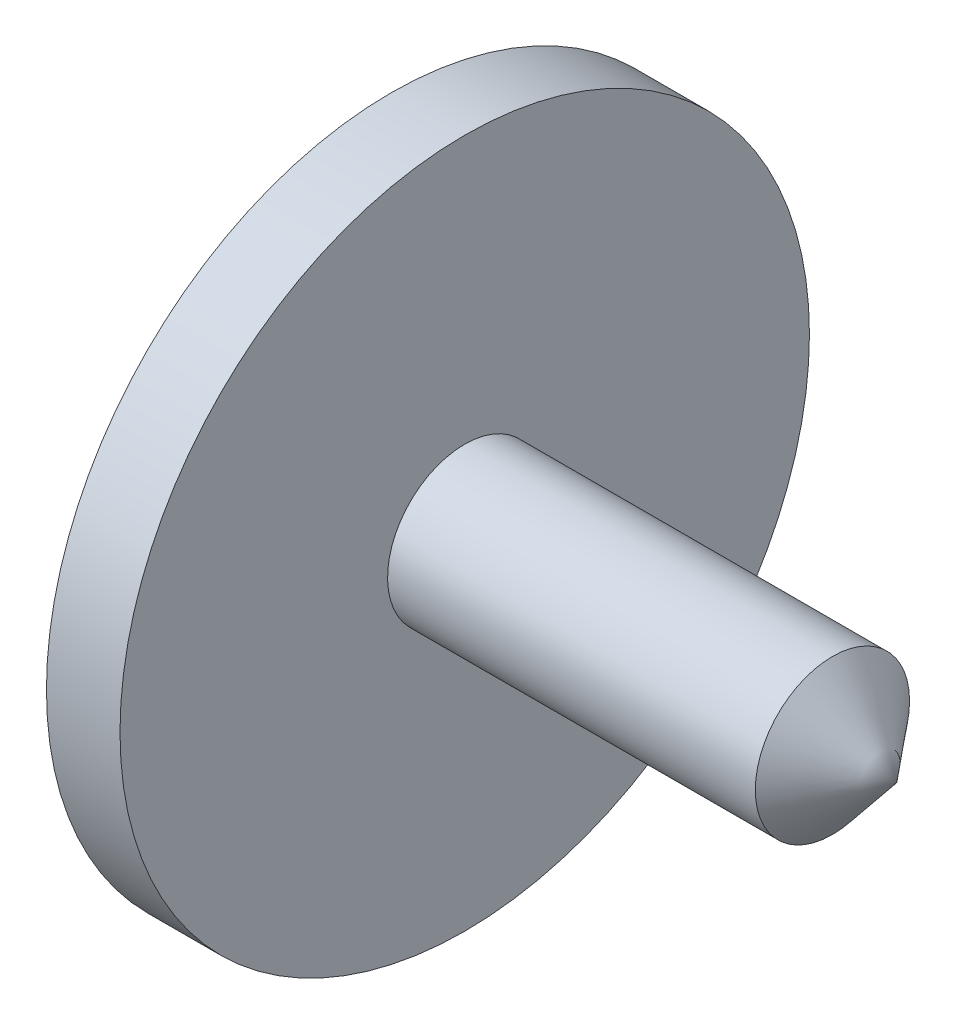
ISO-10303-21;
HEADER;
FILE_DESCRIPTION(('STEP AP214'),'2;1');
FILE_NAME('part.step','',(''),(''),'','','');
FILE_SCHEMA(('AUTOMOTIVE_DESIGN { 1 0 10303 214 1 1 1 1 }'));
ENDSEC;
DATA;
#1=APPLICATION_CONTEXT('core data for automotive mechanical design processes');
#2=APPLICATION_PROTOCOL_DEFINITION('international standard','automotive_design',2000,#1);
#3=PRODUCT_CONTEXT('',#1,'mechanical');
#4=PRODUCT('Part','Part','',(#3));
#5=PRODUCT_RELATED_PRODUCT_CATEGORY('part','',(#4));
#6=PRODUCT_DEFINITION_FORMATION('','',#4);
#7=PRODUCT_DEFINITION_CONTEXT('part definition',#1,'design');
#8=PRODUCT_DEFINITION('design','',#6,#7);
#9=PRODUCT_DEFINITION_SHAPE('','',#8);
#10=(LENGTH_UNIT() NAMED_UNIT(*) SI_UNIT(.MILLI.,.METRE.));
#11=(NAMED_UNIT(*) PLANE_ANGLE_UNIT() SI_UNIT($,.RADIAN.));
#12=(NAMED_UNIT(*) SI_UNIT($,.STERADIAN.) SOLID_ANGLE_UNIT());
#13=UNCERTAINTY_MEASURE_WITH_UNIT(LENGTH_MEASURE(1.E-05),#10,'distance_accuracy_value','');
#14=(GEOMETRIC_REPRESENTATION_CONTEXT(3) GLOBAL_UNCERTAINTY_ASSIGNED_CONTEXT((#13)) GLOBAL_UNIT_ASSIGNED_CONTEXT((#10,
#11,#12)) REPRESENTATION_CONTEXT('',''));
#15=CARTESIAN_POINT('',(0.,0.,0.));
#16=DIRECTION('',(0.,0.,1.));
#17=DIRECTION('',(1.,0.,0.));
#18=AXIS2_PLACEMENT_3D('',#15,#16,#17);
#19=CARTESIAN_POINT('',(0.,0.,0.));
#20=DIRECTION('',(-1.,0.,0.));
#21=DIRECTION('',(0.,-1.,0.));
#22=AXIS2_PLACEMENT_3D('',#19,#20,#21);
#23=PLANE('',#22);
#24=CARTESIAN_POINT('',(0.,0.,0.));
#25=DIRECTION('',(1.,0.,0.));
#26=DIRECTION('',(0.,1.,0.));
#27=AXIS2_PLACEMENT_3D('',#24,#25,#26);
#28=CIRCLE('',#27,37.5);
#29=CARTESIAN_POINT('',(0.,37.5,0.));
#30=VERTEX_POINT('',#29);
#31=EDGE_CURVE('E11',#30,#30,#28,.T.);
#32=ORIENTED_EDGE('',*,*,#31,.F.);
#33=EDGE_LOOP('',(#32));
#34=FACE_BOUND('',#33,.T.);
#35=ADVANCED_FACE('F34',(#34),#23,.T.);
#36=CARTESIAN_POINT('',(55.,0.,0.));
#37=DIRECTION('',(1.,0.,0.));
#38=DIRECTION('',(0.,1.,0.));
#39=AXIS2_PLACEMENT_3D('',#36,#37,#38);
#40=CYLINDRICAL_SURFACE('',#39,37.5);
#41=ORIENTED_EDGE('',*,*,#31,.T.);
#42=EDGE_LOOP('',(#41));
#43=FACE_BOUND('',#42,.T.);
#44=CARTESIAN_POINT('',(8.,0.,0.));
#45=DIRECTION('',(1.,0.,0.));
#46=DIRECTION('',(0.,1.,0.));
#47=AXIS2_PLACEMENT_3D('',#44,#45,#46);
#48=CIRCLE('',#47,37.5);
#49=CARTESIAN_POINT('',(8.,37.5,0.));
#50=VERTEX_POINT('',#49);
#51=EDGE_CURVE('E40',#50,#50,#48,.T.);
#52=ORIENTED_EDGE('',*,*,#51,.F.);
#53=EDGE_LOOP('',(#52));
#54=FACE_BOUND('',#53,.T.);
#55=ADVANCED_FACE('F56',(#43,#54),#40,.T.);
#56=CARTESIAN_POINT('',(8.,37.5,0.));
#57=DIRECTION('',(1.,0.,0.));
#58=DIRECTION('',(0.,1.,0.));
#59=AXIS2_PLACEMENT_3D('',#56,#57,#58);
#60=PLANE('',#59);
#61=ORIENTED_EDGE('',*,*,#51,.T.);
#62=EDGE_LOOP('',(#61));
#63=FACE_BOUND('',#62,.T.);
#64=CARTESIAN_POINT('',(8.,0.,0.));
#65=DIRECTION('',(1.,0.,0.));
#66=DIRECTION('',(0.,1.,0.));
#67=AXIS2_PLACEMENT_3D('',#64,#65,#66);
#68=CIRCLE('',#67,8.39041095890421);
#69=CARTESIAN_POINT('',(8.,8.39041095890421,0.));
#70=VERTEX_POINT('',#69);
#71=EDGE_CURVE('E67',#70,#70,#68,.T.);
#72=ORIENTED_EDGE('',*,*,#71,.F.);
#73=EDGE_LOOP('',(#72));
#74=FACE_BOUND('',#73,.T.);
#75=ADVANCED_FACE('F51',(#63,#74),#60,.T.);
#76=CARTESIAN_POINT('',(55.,0.,0.));
#77=DIRECTION('',(1.,0.,0.));
#78=DIRECTION('',(0.,1.,0.));
#79=AXIS2_PLACEMENT_3D('',#76,#77,#78);
#80=CYLINDRICAL_SURFACE('',#79,8.39041095890421);
#81=ORIENTED_EDGE('',*,*,#71,.T.);
#82=EDGE_LOOP('',(#81));
#83=FACE_BOUND('',#82,.T.);
#84=CARTESIAN_POINT('',(48.,0.,0.));
#85=DIRECTION('',(1.,0.,0.));
#86=DIRECTION('',(0.,1.,0.));
#87=AXIS2_PLACEMENT_3D('',#84,#85,#86);
#88=CIRCLE('',#87,8.39041095890422);
#89=CARTESIAN_POINT('',(48.,8.39041095890422,0.));
#90=VERTEX_POINT('',#89);
#91=EDGE_CURVE('E69',#90,#90,#88,.T.);
#92=ORIENTED_EDGE('',*,*,#91,.F.);
#93=EDGE_LOOP('',(#92));
#94=FACE_BOUND('',#93,.T.);
#95=ADVANCED_FACE('F45',(#83,#94),#80,.T.);
#96=CARTESIAN_POINT('',(55.,0.,0.));
#97=DIRECTION('',(-1.,0.,0.));
#98=DIRECTION('',(0.,-1.,0.));
#99=AXIS2_PLACEMENT_3D('',#96,#97,#98);
#100=CONICAL_SURFACE('',#99,0.,0.875496252904495);
#101=ORIENTED_EDGE('',*,*,#91,.T.);
#102=EDGE_LOOP('',(#101));
#103=FACE_BOUND('',#102,.T.);
#104=CARTESIAN_POINT('',(55.,0.,0.));
#105=VERTEX_POINT('',#104);
#106=VERTEX_LOOP('',#105);
#107=FACE_BOUND('',#106,.T.);
#108=ADVANCED_FACE('F43',(#103,#107),#100,.T.);
#109=CLOSED_SHELL('',(#35,#55,#75,#95,#108));
#110=MANIFOLD_SOLID_BREP('B2',#109);
#111=ADVANCED_BREP_SHAPE_REPRESENTATION('',(#18,#110),#14);
#112=SHAPE_DEFINITION_REPRESENTATION(#9,#111);
ENDSEC;
END-ISO-10303-21;
